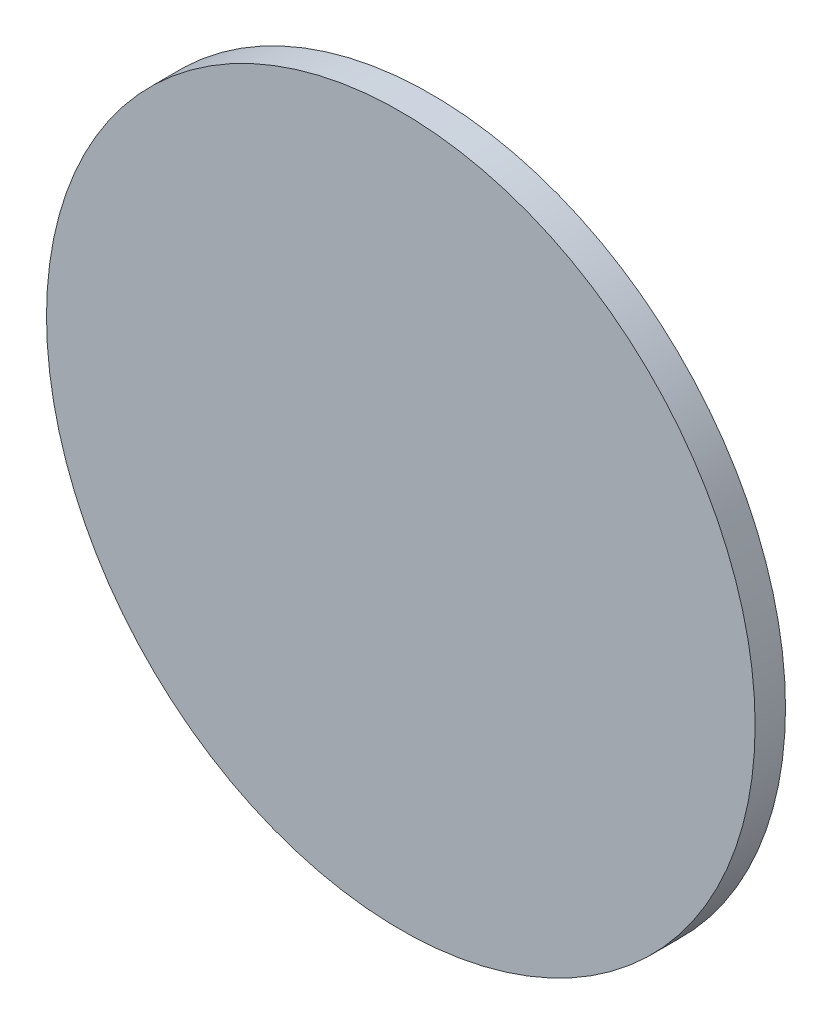
ISO-10303-21;
HEADER;
FILE_DESCRIPTION(('STEP AP214'),'2;1');
FILE_NAME('part.step','',(''),(''),'','','');
FILE_SCHEMA(('AUTOMOTIVE_DESIGN { 1 0 10303 214 1 1 1 1 }'));
ENDSEC;
DATA;
#1=APPLICATION_CONTEXT('core data for automotive mechanical design processes');
#2=APPLICATION_PROTOCOL_DEFINITION('international standard','automotive_design',2000,#1);
#3=PRODUCT_CONTEXT('',#1,'mechanical');
#4=PRODUCT('Part','Part','',(#3));
#5=PRODUCT_RELATED_PRODUCT_CATEGORY('part','',(#4));
#6=PRODUCT_DEFINITION_FORMATION('','',#4);
#7=PRODUCT_DEFINITION_CONTEXT('part definition',#1,'design');
#8=PRODUCT_DEFINITION('design','',#6,#7);
#9=PRODUCT_DEFINITION_SHAPE('','',#8);
#10=(LENGTH_UNIT() NAMED_UNIT(*) SI_UNIT(.MILLI.,.METRE.));
#11=(NAMED_UNIT(*) PLANE_ANGLE_UNIT() SI_UNIT($,.RADIAN.));
#12=(NAMED_UNIT(*) SI_UNIT($,.STERADIAN.) SOLID_ANGLE_UNIT());
#13=UNCERTAINTY_MEASURE_WITH_UNIT(LENGTH_MEASURE(1.E-05),#10,'distance_accuracy_value','');
#14=(GEOMETRIC_REPRESENTATION_CONTEXT(3) GLOBAL_UNCERTAINTY_ASSIGNED_CONTEXT((#13)) GLOBAL_UNIT_ASSIGNED_CONTEXT((#10,
#11,#12)) REPRESENTATION_CONTEXT('',''));
#15=CARTESIAN_POINT('',(0.,0.,0.));
#16=DIRECTION('',(0.,0.,1.));
#17=DIRECTION('',(1.,0.,0.));
#18=AXIS2_PLACEMENT_3D('',#15,#16,#17);
#19=CARTESIAN_POINT('',(0.,0.,30.));
#20=DIRECTION('',(0.,0.,-1.));
#21=DIRECTION('',(-1.,0.,0.));
#22=AXIS2_PLACEMENT_3D('',#19,#20,#21);
#23=CYLINDRICAL_SURFACE('',#22,350.);
#24=CARTESIAN_POINT('',(0.,0.,30.));
#25=DIRECTION('',(0.,0.,1.));
#26=DIRECTION('',(1.,0.,0.));
#27=AXIS2_PLACEMENT_3D('',#24,#25,#26);
#28=CIRCLE('',#27,350.);
#29=CARTESIAN_POINT('',(350.,0.,30.));
#30=VERTEX_POINT('',#29);
#31=EDGE_CURVE('E10',#30,#30,#28,.T.);
#32=ORIENTED_EDGE('',*,*,#31,.F.);
#33=EDGE_LOOP('',(#32));
#34=FACE_BOUND('',#33,.T.);
#35=CARTESIAN_POINT('',(0.,0.,0.));
#36=DIRECTION('',(0.,0.,1.));
#37=DIRECTION('',(1.,0.,0.));
#38=AXIS2_PLACEMENT_3D('',#35,#36,#37);
#39=CIRCLE('',#38,350.);
#40=CARTESIAN_POINT('',(350.,0.,0.));
#41=VERTEX_POINT('',#40);
#42=EDGE_CURVE('E38',#41,#41,#39,.T.);
#43=ORIENTED_EDGE('',*,*,#42,.T.);
#44=EDGE_LOOP('',(#43));
#45=FACE_BOUND('',#44,.T.);
#46=ADVANCED_FACE('F35',(#34,#45),#23,.T.);
#47=CARTESIAN_POINT('',(0.,0.,30.));
#48=DIRECTION('',(0.,0.,1.));
#49=DIRECTION('',(1.,0.,0.));
#50=AXIS2_PLACEMENT_3D('',#47,#48,#49);
#51=PLANE('',#50);
#52=ORIENTED_EDGE('',*,*,#31,.T.);
#53=EDGE_LOOP('',(#52));
#54=FACE_BOUND('',#53,.T.);
#55=ADVANCED_FACE('F50',(#54),#51,.T.);
#56=CARTESIAN_POINT('',(0.,0.,0.));
#57=DIRECTION('',(0.,0.,1.));
#58=DIRECTION('',(1.,0.,0.));
#59=AXIS2_PLACEMENT_3D('',#56,#57,#58);
#60=PLANE('',#59);
#61=ORIENTED_EDGE('',*,*,#42,.F.);
#62=EDGE_LOOP('',(#61));
#63=FACE_BOUND('',#62,.T.);
#64=ADVANCED_FACE('F48',(#63),#60,.F.);
#65=CLOSED_SHELL('',(#46,#55,#64));
#66=MANIFOLD_SOLID_BREP('B2',#65);
#67=ADVANCED_BREP_SHAPE_REPRESENTATION('',(#18,#66),#14);
#68=SHAPE_DEFINITION_REPRESENTATION(#9,#67);
ENDSEC;
END-ISO-10303-21;
